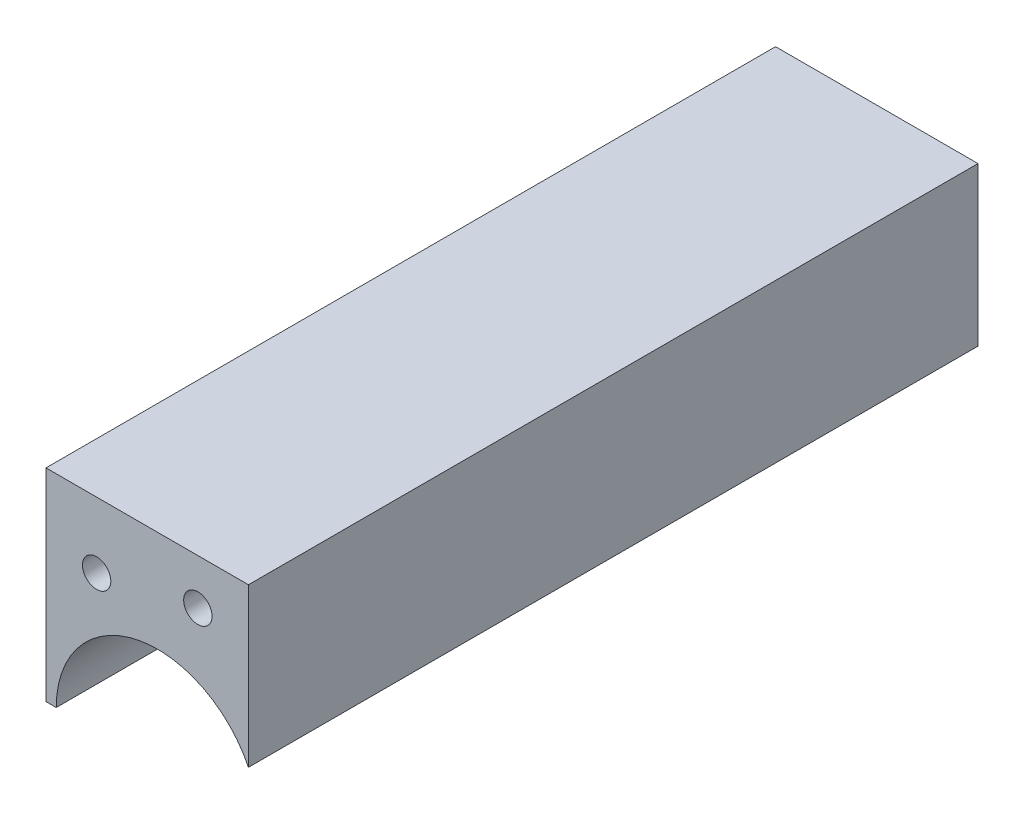
ISO-10303-21;
HEADER;
FILE_DESCRIPTION(('STEP AP214'),'2;1');
FILE_NAME('part.step','',(''),(''),'','','');
FILE_SCHEMA(('AUTOMOTIVE_DESIGN { 1 0 10303 214 1 1 1 1 }'));
ENDSEC;
DATA;
#1=APPLICATION_CONTEXT('core data for automotive mechanical design processes');
#2=APPLICATION_PROTOCOL_DEFINITION('international standard','automotive_design',2000,#1);
#3=PRODUCT_CONTEXT('',#1,'mechanical');
#4=PRODUCT('Part','Part','',(#3));
#5=PRODUCT_RELATED_PRODUCT_CATEGORY('part','',(#4));
#6=PRODUCT_DEFINITION_FORMATION('','',#4);
#7=PRODUCT_DEFINITION_CONTEXT('part definition',#1,'design');
#8=PRODUCT_DEFINITION('design','',#6,#7);
#9=PRODUCT_DEFINITION_SHAPE('','',#8);
#10=(LENGTH_UNIT() NAMED_UNIT(*) SI_UNIT(.MILLI.,.METRE.));
#11=(NAMED_UNIT(*) PLANE_ANGLE_UNIT() SI_UNIT($,.RADIAN.));
#12=(NAMED_UNIT(*) SI_UNIT($,.STERADIAN.) SOLID_ANGLE_UNIT());
#13=UNCERTAINTY_MEASURE_WITH_UNIT(LENGTH_MEASURE(1.E-05),#10,'distance_accuracy_value','');
#14=(GEOMETRIC_REPRESENTATION_CONTEXT(3) GLOBAL_UNCERTAINTY_ASSIGNED_CONTEXT((#13)) GLOBAL_UNIT_ASSIGNED_CONTEXT((#10,
#11,#12)) REPRESENTATION_CONTEXT('',''));
#15=CARTESIAN_POINT('',(0.,0.,0.));
#16=DIRECTION('',(0.,0.,1.));
#17=DIRECTION('',(1.,0.,0.));
#18=AXIS2_PLACEMENT_3D('',#15,#16,#17);
#19=CARTESIAN_POINT('',(11.01,0.,72.07));
#20=DIRECTION('',(0.,0.,1.));
#21=DIRECTION('',(1.,0.,0.));
#22=AXIS2_PLACEMENT_3D('',#19,#20,#21);
#23=PLANE('',#22);
#24=CARTESIAN_POINT('',(5.,13.5,72.07));
#25=DIRECTION('',(0.,0.,1.));
#26=DIRECTION('',(1.,0.,0.));
#27=AXIS2_PLACEMENT_3D('',#24,#25,#26);
#28=CIRCLE('',#27,1.4);
#29=CARTESIAN_POINT('',(3.6,13.5,72.07));
#30=VERTEX_POINT('',#29);
#31=EDGE_CURVE('E118',#30,#30,#28,.T.);
#32=ORIENTED_EDGE('',*,*,#31,.F.);
#33=EDGE_LOOP('',(#32));
#34=FACE_BOUND('',#33,.T.);
#35=DIRECTION('',(0.,-1.,0.));
#36=VECTOR('',#35,1.);
#37=CARTESIAN_POINT('',(0.,0.,72.07));
#38=LINE('',#37,#36);
#39=CARTESIAN_POINT('',(0.,20.,72.07));
#40=VERTEX_POINT('',#39);
#41=CARTESIAN_POINT('',(0.,0.,72.07));
#42=VERTEX_POINT('',#41);
#43=EDGE_CURVE('E123',#40,#42,#38,.T.);
#44=ORIENTED_EDGE('',*,*,#43,.T.);
#45=DIRECTION('',(1.,0.,0.));
#46=VECTOR('',#45,1.);
#47=CARTESIAN_POINT('',(0.,0.,72.07));
#48=LINE('',#47,#46);
#49=CARTESIAN_POINT('',(1.00999999999999,0.,72.07));
#50=VERTEX_POINT('',#49);
#51=EDGE_CURVE('E90',#42,#50,#48,.T.);
#52=ORIENTED_EDGE('',*,*,#51,.T.);
#53=CARTESIAN_POINT('',(11.01,0.,72.07));
#54=DIRECTION('',(0.,0.,-1.));
#55=DIRECTION('',(1.,0.,0.));
#56=AXIS2_PLACEMENT_3D('',#53,#54,#55);
#57=CIRCLE('',#56,10.);
#58=CARTESIAN_POINT('',(20.,4.37948627124234,72.07));
#59=VERTEX_POINT('',#58);
#60=EDGE_CURVE('E94',#50,#59,#57,.T.);
#61=ORIENTED_EDGE('',*,*,#60,.T.);
#62=DIRECTION('',(0.,1.,0.));
#63=VECTOR('',#62,1.);
#64=CARTESIAN_POINT('',(20.,4.37948627124234,72.07));
#65=LINE('',#64,#63);
#66=CARTESIAN_POINT('',(20.,20.,72.07));
#67=VERTEX_POINT('',#66);
#68=EDGE_CURVE('E98',#59,#67,#65,.T.);
#69=ORIENTED_EDGE('',*,*,#68,.T.);
#70=DIRECTION('',(-1.,0.,0.));
#71=VECTOR('',#70,1.);
#72=CARTESIAN_POINT('',(0.,20.,72.07));
#73=LINE('',#72,#71);
#74=EDGE_CURVE('E56',#67,#40,#73,.T.);
#75=ORIENTED_EDGE('',*,*,#74,.T.);
#76=EDGE_LOOP('',(#44,#52,#61,#69,#75));
#77=FACE_BOUND('',#76,.T.);
#78=CARTESIAN_POINT('',(15.,15.5,72.07));
#79=DIRECTION('',(0.,0.,1.));
#80=DIRECTION('',(1.,0.,0.));
#81=AXIS2_PLACEMENT_3D('',#78,#79,#80);
#82=CIRCLE('',#81,1.4);
#83=CARTESIAN_POINT('',(13.6,15.5,72.07));
#84=VERTEX_POINT('',#83);
#85=EDGE_CURVE('E160',#84,#84,#82,.T.);
#86=ORIENTED_EDGE('',*,*,#85,.F.);
#87=EDGE_LOOP('',(#86));
#88=FACE_BOUND('',#87,.T.);
#89=ADVANCED_FACE('F39',(#34,#77,#88),#23,.T.);
#90=CARTESIAN_POINT('',(11.01,0.,0.));
#91=DIRECTION('',(0.,0.,1.));
#92=DIRECTION('',(1.,0.,0.));
#93=AXIS2_PLACEMENT_3D('',#90,#91,#92);
#94=PLANE('',#93);
#95=DIRECTION('',(0.,-1.,0.));
#96=VECTOR('',#95,1.);
#97=CARTESIAN_POINT('',(0.,0.,0.));
#98=LINE('',#97,#96);
#99=CARTESIAN_POINT('',(0.,20.,0.));
#100=VERTEX_POINT('',#99);
#101=CARTESIAN_POINT('',(0.,0.,0.));
#102=VERTEX_POINT('',#101);
#103=EDGE_CURVE('E114',#100,#102,#98,.T.);
#104=ORIENTED_EDGE('',*,*,#103,.F.);
#105=DIRECTION('',(-1.,0.,0.));
#106=VECTOR('',#105,1.);
#107=CARTESIAN_POINT('',(0.,20.,0.));
#108=LINE('',#107,#106);
#109=CARTESIAN_POINT('',(20.,20.,0.));
#110=VERTEX_POINT('',#109);
#111=EDGE_CURVE('E82',#110,#100,#108,.T.);
#112=ORIENTED_EDGE('',*,*,#111,.F.);
#113=DIRECTION('',(0.,1.,0.));
#114=VECTOR('',#113,1.);
#115=CARTESIAN_POINT('',(20.,4.37948627124234,0.));
#116=LINE('',#115,#114);
#117=CARTESIAN_POINT('',(20.,4.37948627124234,0.));
#118=VERTEX_POINT('',#117);
#119=EDGE_CURVE('E76',#118,#110,#116,.T.);
#120=ORIENTED_EDGE('',*,*,#119,.F.);
#121=CARTESIAN_POINT('',(11.01,0.,0.));
#122=DIRECTION('',(0.,0.,-1.));
#123=DIRECTION('',(1.,0.,0.));
#124=AXIS2_PLACEMENT_3D('',#121,#122,#123);
#125=CIRCLE('',#124,10.);
#126=CARTESIAN_POINT('',(1.00999999999999,0.,0.));
#127=VERTEX_POINT('',#126);
#128=EDGE_CURVE('E105',#127,#118,#125,.T.);
#129=ORIENTED_EDGE('',*,*,#128,.F.);
#130=DIRECTION('',(1.,0.,0.));
#131=VECTOR('',#130,1.);
#132=CARTESIAN_POINT('',(0.,0.,0.));
#133=LINE('',#132,#131);
#134=EDGE_CURVE('E117',#102,#127,#133,.T.);
#135=ORIENTED_EDGE('',*,*,#134,.F.);
#136=EDGE_LOOP('',(#104,#112,#120,#129,#135));
#137=FACE_BOUND('',#136,.T.);
#138=CARTESIAN_POINT('',(5.,13.5,0.));
#139=DIRECTION('',(0.,0.,1.));
#140=DIRECTION('',(1.,0.,0.));
#141=AXIS2_PLACEMENT_3D('',#138,#139,#140);
#142=CIRCLE('',#141,1.4);
#143=CARTESIAN_POINT('',(3.6,13.5,0.));
#144=VERTEX_POINT('',#143);
#145=EDGE_CURVE('E166',#144,#144,#142,.T.);
#146=ORIENTED_EDGE('',*,*,#145,.T.);
#147=EDGE_LOOP('',(#146));
#148=FACE_BOUND('',#147,.T.);
#149=CARTESIAN_POINT('',(15.,15.5,0.));
#150=DIRECTION('',(0.,0.,1.));
#151=DIRECTION('',(1.,0.,0.));
#152=AXIS2_PLACEMENT_3D('',#149,#150,#151);
#153=CIRCLE('',#152,1.4);
#154=CARTESIAN_POINT('',(13.6,15.5,0.));
#155=VERTEX_POINT('',#154);
#156=EDGE_CURVE('E163',#155,#155,#153,.T.);
#157=ORIENTED_EDGE('',*,*,#156,.T.);
#158=EDGE_LOOP('',(#157));
#159=FACE_BOUND('',#158,.T.);
#160=ADVANCED_FACE('F127',(#137,#148,#159),#94,.F.);
#161=CARTESIAN_POINT('',(0.,0.,72.07));
#162=DIRECTION('',(1.,0.,0.));
#163=DIRECTION('',(0.,0.,-1.));
#164=AXIS2_PLACEMENT_3D('',#161,#162,#163);
#165=PLANE('',#164);
#166=ORIENTED_EDGE('',*,*,#103,.T.);
#167=DIRECTION('',(0.,0.,-1.));
#168=VECTOR('',#167,1.);
#169=CARTESIAN_POINT('',(0.,0.,72.07));
#170=LINE('',#169,#168);
#171=EDGE_CURVE('E11',#42,#102,#170,.T.);
#172=ORIENTED_EDGE('',*,*,#171,.F.);
#173=ORIENTED_EDGE('',*,*,#43,.F.);
#174=DIRECTION('',(0.,0.,-1.));
#175=VECTOR('',#174,1.);
#176=CARTESIAN_POINT('',(0.,20.,72.07));
#177=LINE('',#176,#175);
#178=EDGE_CURVE('E110',#40,#100,#177,.T.);
#179=ORIENTED_EDGE('',*,*,#178,.T.);
#180=EDGE_LOOP('',(#166,#172,#173,#179));
#181=FACE_BOUND('',#180,.T.);
#182=ADVANCED_FACE('F41',(#181),#165,.F.);
#183=CARTESIAN_POINT('',(0.,0.,72.07));
#184=DIRECTION('',(0.,1.,0.));
#185=DIRECTION('',(0.,0.,1.));
#186=AXIS2_PLACEMENT_3D('',#183,#184,#185);
#187=PLANE('',#186);
#188=ORIENTED_EDGE('',*,*,#134,.T.);
#189=DIRECTION('',(0.,0.,-1.));
#190=VECTOR('',#189,1.);
#191=CARTESIAN_POINT('',(1.00999999999999,0.,72.07));
#192=LINE('',#191,#190);
#193=EDGE_CURVE('E48',#50,#127,#192,.T.);
#194=ORIENTED_EDGE('',*,*,#193,.F.);
#195=ORIENTED_EDGE('',*,*,#51,.F.);
#196=ORIENTED_EDGE('',*,*,#171,.T.);
#197=EDGE_LOOP('',(#188,#194,#195,#196));
#198=FACE_BOUND('',#197,.T.);
#199=ADVANCED_FACE('F201',(#198),#187,.F.);
#200=CARTESIAN_POINT('',(11.01,0.,72.07));
#201=DIRECTION('',(0.,0.,-1.));
#202=DIRECTION('',(-1.,0.,0.));
#203=AXIS2_PLACEMENT_3D('',#200,#201,#202);
#204=CYLINDRICAL_SURFACE('',#203,10.);
#205=ORIENTED_EDGE('',*,*,#128,.T.);
#206=DIRECTION('',(0.,0.,-1.));
#207=VECTOR('',#206,1.);
#208=CARTESIAN_POINT('',(20.,4.37948627124234,72.07));
#209=LINE('',#208,#207);
#210=EDGE_CURVE('E102',#59,#118,#209,.T.);
#211=ORIENTED_EDGE('',*,*,#210,.F.);
#212=ORIENTED_EDGE('',*,*,#60,.F.);
#213=ORIENTED_EDGE('',*,*,#193,.T.);
#214=EDGE_LOOP('',(#205,#211,#212,#213));
#215=FACE_BOUND('',#214,.T.);
#216=ADVANCED_FACE('F103',(#215),#204,.F.);
#217=CARTESIAN_POINT('',(20.,4.37948627124234,72.07));
#218=DIRECTION('',(-1.,0.,0.));
#219=DIRECTION('',(0.,0.,1.));
#220=AXIS2_PLACEMENT_3D('',#217,#218,#219);
#221=PLANE('',#220);
#222=ORIENTED_EDGE('',*,*,#119,.T.);
#223=DIRECTION('',(0.,0.,-1.));
#224=VECTOR('',#223,1.);
#225=CARTESIAN_POINT('',(20.,20.,72.07));
#226=LINE('',#225,#224);
#227=EDGE_CURVE('E106',#67,#110,#226,.T.);
#228=ORIENTED_EDGE('',*,*,#227,.F.);
#229=ORIENTED_EDGE('',*,*,#68,.F.);
#230=ORIENTED_EDGE('',*,*,#210,.T.);
#231=EDGE_LOOP('',(#222,#228,#229,#230));
#232=FACE_BOUND('',#231,.T.);
#233=ADVANCED_FACE('F108',(#232),#221,.F.);
#234=CARTESIAN_POINT('',(0.,20.,72.07));
#235=DIRECTION('',(0.,-1.,0.));
#236=DIRECTION('',(0.,0.,-1.));
#237=AXIS2_PLACEMENT_3D('',#234,#235,#236);
#238=PLANE('',#237);
#239=ORIENTED_EDGE('',*,*,#111,.T.);
#240=ORIENTED_EDGE('',*,*,#178,.F.);
#241=ORIENTED_EDGE('',*,*,#74,.F.);
#242=ORIENTED_EDGE('',*,*,#227,.T.);
#243=EDGE_LOOP('',(#239,#240,#241,#242));
#244=FACE_BOUND('',#243,.T.);
#245=ADVANCED_FACE('F132',(#244),#238,.F.);
#246=CARTESIAN_POINT('',(5.,13.5,72.07));
#247=DIRECTION('',(0.,0.,-1.));
#248=DIRECTION('',(-1.,0.,0.));
#249=AXIS2_PLACEMENT_3D('',#246,#247,#248);
#250=CYLINDRICAL_SURFACE('',#249,1.4);
#251=CARTESIAN_POINT('',(3.6,13.5,72.07));
#252=CARTESIAN_POINT('',(3.6,13.5,71.3192708333333));
#253=CARTESIAN_POINT('',(3.6,13.5,70.5685416666667));
#254=CARTESIAN_POINT('',(3.6,13.5,69.0670833333333));
#255=CARTESIAN_POINT('',(3.6,13.5,68.3163541666667));
#256=CARTESIAN_POINT('',(3.6,13.5,66.8148958333333));
#257=CARTESIAN_POINT('',(3.6,13.5,66.0641666666667));
#258=CARTESIAN_POINT('',(3.6,13.5,64.5627083333333));
#259=CARTESIAN_POINT('',(3.6,13.5,63.8119791666667));
#260=CARTESIAN_POINT('',(3.6,13.5,62.3105208333333));
#261=CARTESIAN_POINT('',(3.6,13.5,61.5597916666666));
#262=CARTESIAN_POINT('',(3.6,13.5,60.0583333333333));
#263=CARTESIAN_POINT('',(3.6,13.5,59.3076041666666));
#264=CARTESIAN_POINT('',(3.6,13.5,57.8061458333333));
#265=CARTESIAN_POINT('',(3.6,13.5,57.0554166666667));
#266=CARTESIAN_POINT('',(3.6,13.5,55.5539583333333));
#267=CARTESIAN_POINT('',(3.6,13.5,54.8032291666667));
#268=CARTESIAN_POINT('',(3.6,13.5,53.3017708333333));
#269=CARTESIAN_POINT('',(3.6,13.5,52.5510416666666));
#270=CARTESIAN_POINT('',(3.6,13.5,51.0495833333333));
#271=CARTESIAN_POINT('',(3.6,13.5,50.2988541666667));
#272=CARTESIAN_POINT('',(3.6,13.5,48.7973958333333));
#273=CARTESIAN_POINT('',(3.6,13.5,48.0466666666666));
#274=CARTESIAN_POINT('',(3.6,13.5,46.5452083333333));
#275=CARTESIAN_POINT('',(3.6,13.5,45.7944791666666));
#276=CARTESIAN_POINT('',(3.6,13.5,44.2930208333333));
#277=CARTESIAN_POINT('',(3.6,13.5,43.5422916666666));
#278=CARTESIAN_POINT('',(3.6,13.5,42.0408333333333));
#279=CARTESIAN_POINT('',(3.6,13.5,41.2901041666667));
#280=CARTESIAN_POINT('',(3.6,13.5,39.7886458333333));
#281=CARTESIAN_POINT('',(3.6,13.5,39.0379166666667));
#282=CARTESIAN_POINT('',(3.6,13.5,37.5364583333333));
#283=CARTESIAN_POINT('',(3.6,13.5,36.7857291666666));
#284=CARTESIAN_POINT('',(3.6,13.5,35.2842708333333));
#285=CARTESIAN_POINT('',(3.6,13.5,34.5335416666666));
#286=CARTESIAN_POINT('',(3.6,13.5,33.0320833333333));
#287=CARTESIAN_POINT('',(3.6,13.5,32.2813541666666));
#288=CARTESIAN_POINT('',(3.6,13.5,30.7798958333333));
#289=CARTESIAN_POINT('',(3.6,13.5,30.0291666666666));
#290=CARTESIAN_POINT('',(3.6,13.5,28.5277083333333));
#291=CARTESIAN_POINT('',(3.6,13.5,27.7769791666666));
#292=CARTESIAN_POINT('',(3.6,13.5,26.2755208333333));
#293=CARTESIAN_POINT('',(3.6,13.5,25.5247916666666));
#294=CARTESIAN_POINT('',(3.6,13.5,24.0233333333333));
#295=CARTESIAN_POINT('',(3.6,13.5,23.2726041666666));
#296=CARTESIAN_POINT('',(3.6,13.5,21.7711458333333));
#297=CARTESIAN_POINT('',(3.6,13.5,21.0204166666666));
#298=CARTESIAN_POINT('',(3.6,13.5,19.5189583333333));
#299=CARTESIAN_POINT('',(3.6,13.5,18.7682291666666));
#300=CARTESIAN_POINT('',(3.6,13.5,17.2667708333333));
#301=CARTESIAN_POINT('',(3.6,13.5,16.5160416666666));
#302=CARTESIAN_POINT('',(3.6,13.5,15.0145833333333));
#303=CARTESIAN_POINT('',(3.6,13.5,14.2638541666666));
#304=CARTESIAN_POINT('',(3.6,13.5,12.7623958333333));
#305=CARTESIAN_POINT('',(3.6,13.5,12.0116666666666));
#306=CARTESIAN_POINT('',(3.6,13.5,10.5102083333333));
#307=CARTESIAN_POINT('',(3.6,13.5,9.75947916666666));
#308=CARTESIAN_POINT('',(3.6,13.5,8.25802083333333));
#309=CARTESIAN_POINT('',(3.6,13.5,7.50729166666666));
#310=CARTESIAN_POINT('',(3.6,13.5,6.00583333333333));
#311=CARTESIAN_POINT('',(3.6,13.5,5.25510416666666));
#312=CARTESIAN_POINT('',(3.6,13.5,3.75364583333332));
#313=CARTESIAN_POINT('',(3.6,13.5,3.00291666666666));
#314=CARTESIAN_POINT('',(3.6,13.5,1.50145833333332));
#315=CARTESIAN_POINT('',(3.6,13.5,0.750729166666654));
#316=CARTESIAN_POINT('',(3.6,13.5,0.));
#317=B_SPLINE_CURVE_WITH_KNOTS('',3,(#251,#252,#253,#254,#255,#256,#257,#258,#259,#260,#261,
#262,#263,#264,#265,#266,#267,#268,#269,#270,#271,#272,#273,#274,#275,#276,#277,#278,#279,#280,
#281,#282,#283,#284,#285,#286,#287,#288,#289,#290,#291,#292,#293,#294,#295,#296,#297,#298,#299,
#300,#301,#302,#303,#304,#305,#306,#307,#308,#309,#310,#311,#312,#313,#314,#315,#316),
.UNSPECIFIED.,.F.,.F.,(4,2,2,2,2,2,2,2,2,2,2,2,2,2,2,2,2,2,2,2,2,2,2,2,2,2,2,2,2,2,2,2,4),(0.,
2.2521875,4.504375,6.75656250000001,9.00875000000001,11.2609375,13.513125,15.7653125,18.0175,
20.2696875,22.521875,24.7740625,27.02625,29.2784375,31.530625,33.7828125,36.035,38.2871875,
40.539375,42.7915625,45.04375,47.2959375,49.548125,51.8003125,54.0525,56.3046875,58.556875,
60.8090625,63.06125,65.3134375,67.565625,69.8178125,72.07),.UNSPECIFIED.);
#318=EDGE_CURVE('BSEAM134',#30,#144,#317,.T.);
#319=ORIENTED_EDGE('',*,*,#31,.T.);
#320=ORIENTED_EDGE('',*,*,#145,.F.);
#321=ORIENTED_EDGE('',*,*,#318,.T.);
#322=ORIENTED_EDGE('',*,*,#318,.F.);
#323=EDGE_LOOP('',(#319,#321,#320,#322));
#324=FACE_BOUND('',#323,.T.);
#325=ADVANCED_FACE('F134',(#324),#250,.F.);
#326=CARTESIAN_POINT('',(15.,15.5,72.07));
#327=DIRECTION('',(0.,0.,-1.));
#328=DIRECTION('',(-1.,0.,0.));
#329=AXIS2_PLACEMENT_3D('',#326,#327,#328);
#330=CYLINDRICAL_SURFACE('',#329,1.4);
#331=CARTESIAN_POINT('',(13.6,15.5,72.07));
#332=CARTESIAN_POINT('',(13.6,15.5,71.3192708333333));
#333=CARTESIAN_POINT('',(13.6,15.5,70.5685416666667));
#334=CARTESIAN_POINT('',(13.6,15.5,69.0670833333333));
#335=CARTESIAN_POINT('',(13.6,15.5,68.3163541666667));
#336=CARTESIAN_POINT('',(13.6,15.5,66.8148958333333));
#337=CARTESIAN_POINT('',(13.6,15.5,66.0641666666667));
#338=CARTESIAN_POINT('',(13.6,15.5,64.5627083333333));
#339=CARTESIAN_POINT('',(13.6,15.5,63.8119791666667));
#340=CARTESIAN_POINT('',(13.6,15.5,62.3105208333333));
#341=CARTESIAN_POINT('',(13.6,15.5,61.5597916666666));
#342=CARTESIAN_POINT('',(13.6,15.5,60.0583333333333));
#343=CARTESIAN_POINT('',(13.6,15.5,59.3076041666666));
#344=CARTESIAN_POINT('',(13.6,15.5,57.8061458333333));
#345=CARTESIAN_POINT('',(13.6,15.5,57.0554166666667));
#346=CARTESIAN_POINT('',(13.6,15.5,55.5539583333333));
#347=CARTESIAN_POINT('',(13.6,15.5,54.8032291666667));
#348=CARTESIAN_POINT('',(13.6,15.5,53.3017708333333));
#349=CARTESIAN_POINT('',(13.6,15.5,52.5510416666666));
#350=CARTESIAN_POINT('',(13.6,15.5,51.0495833333333));
#351=CARTESIAN_POINT('',(13.6,15.5,50.2988541666667));
#352=CARTESIAN_POINT('',(13.6,15.5,48.7973958333333));
#353=CARTESIAN_POINT('',(13.6,15.5,48.0466666666666));
#354=CARTESIAN_POINT('',(13.6,15.5,46.5452083333333));
#355=CARTESIAN_POINT('',(13.6,15.5,45.7944791666666));
#356=CARTESIAN_POINT('',(13.6,15.5,44.2930208333333));
#357=CARTESIAN_POINT('',(13.6,15.5,43.5422916666666));
#358=CARTESIAN_POINT('',(13.6,15.5,42.0408333333333));
#359=CARTESIAN_POINT('',(13.6,15.5,41.2901041666667));
#360=CARTESIAN_POINT('',(13.6,15.5,39.7886458333333));
#361=CARTESIAN_POINT('',(13.6,15.5,39.0379166666667));
#362=CARTESIAN_POINT('',(13.6,15.5,37.5364583333333));
#363=CARTESIAN_POINT('',(13.6,15.5,36.7857291666666));
#364=CARTESIAN_POINT('',(13.6,15.5,35.2842708333333));
#365=CARTESIAN_POINT('',(13.6,15.5,34.5335416666666));
#366=CARTESIAN_POINT('',(13.6,15.5,33.0320833333333));
#367=CARTESIAN_POINT('',(13.6,15.5,32.2813541666666));
#368=CARTESIAN_POINT('',(13.6,15.5,30.7798958333333));
#369=CARTESIAN_POINT('',(13.6,15.5,30.0291666666666));
#370=CARTESIAN_POINT('',(13.6,15.5,28.5277083333333));
#371=CARTESIAN_POINT('',(13.6,15.5,27.7769791666666));
#372=CARTESIAN_POINT('',(13.6,15.5,26.2755208333333));
#373=CARTESIAN_POINT('',(13.6,15.5,25.5247916666666));
#374=CARTESIAN_POINT('',(13.6,15.5,24.0233333333333));
#375=CARTESIAN_POINT('',(13.6,15.5,23.2726041666666));
#376=CARTESIAN_POINT('',(13.6,15.5,21.7711458333333));
#377=CARTESIAN_POINT('',(13.6,15.5,21.0204166666666));
#378=CARTESIAN_POINT('',(13.6,15.5,19.5189583333333));
#379=CARTESIAN_POINT('',(13.6,15.5,18.7682291666666));
#380=CARTESIAN_POINT('',(13.6,15.5,17.2667708333333));
#381=CARTESIAN_POINT('',(13.6,15.5,16.5160416666666));
#382=CARTESIAN_POINT('',(13.6,15.5,15.0145833333333));
#383=CARTESIAN_POINT('',(13.6,15.5,14.2638541666666));
#384=CARTESIAN_POINT('',(13.6,15.5,12.7623958333333));
#385=CARTESIAN_POINT('',(13.6,15.5,12.0116666666666));
#386=CARTESIAN_POINT('',(13.6,15.5,10.5102083333333));
#387=CARTESIAN_POINT('',(13.6,15.5,9.75947916666666));
#388=CARTESIAN_POINT('',(13.6,15.5,8.25802083333333));
#389=CARTESIAN_POINT('',(13.6,15.5,7.50729166666666));
#390=CARTESIAN_POINT('',(13.6,15.5,6.00583333333333));
#391=CARTESIAN_POINT('',(13.6,15.5,5.25510416666666));
#392=CARTESIAN_POINT('',(13.6,15.5,3.75364583333332));
#393=CARTESIAN_POINT('',(13.6,15.5,3.00291666666666));
#394=CARTESIAN_POINT('',(13.6,15.5,1.50145833333332));
#395=CARTESIAN_POINT('',(13.6,15.5,0.750729166666654));
#396=CARTESIAN_POINT('',(13.6,15.5,0.));
#397=B_SPLINE_CURVE_WITH_KNOTS('',3,(#331,#332,#333,#334,#335,#336,#337,#338,#339,#340,#341,
#342,#343,#344,#345,#346,#347,#348,#349,#350,#351,#352,#353,#354,#355,#356,#357,#358,#359,#360,
#361,#362,#363,#364,#365,#366,#367,#368,#369,#370,#371,#372,#373,#374,#375,#376,#377,#378,#379,
#380,#381,#382,#383,#384,#385,#386,#387,#388,#389,#390,#391,#392,#393,#394,#395,#396),
.UNSPECIFIED.,.F.,.F.,(4,2,2,2,2,2,2,2,2,2,2,2,2,2,2,2,2,2,2,2,2,2,2,2,2,2,2,2,2,2,2,2,4),(0.,
2.2521875,4.504375,6.75656250000001,9.00875000000001,11.2609375,13.513125,15.7653125,18.0175,
20.2696875,22.521875,24.7740625,27.02625,29.2784375,31.530625,33.7828125,36.035,38.2871875,
40.539375,42.7915625,45.04375,47.2959375,49.548125,51.8003125,54.0525,56.3046875,58.556875,
60.8090625,63.06125,65.3134375,67.565625,69.8178125,72.07),.UNSPECIFIED.);
#398=EDGE_CURVE('BSEAM140',#84,#155,#397,.T.);
#399=ORIENTED_EDGE('',*,*,#85,.T.);
#400=ORIENTED_EDGE('',*,*,#156,.F.);
#401=ORIENTED_EDGE('',*,*,#398,.T.);
#402=ORIENTED_EDGE('',*,*,#398,.F.);
#403=EDGE_LOOP('',(#399,#401,#400,#402));
#404=FACE_BOUND('',#403,.T.);
#405=ADVANCED_FACE('F140',(#404),#330,.F.);
#406=CLOSED_SHELL('',(#89,#160,#182,#199,#216,#233,#245,#325,#405));
#407=MANIFOLD_SOLID_BREP('B2',#406);
#408=ADVANCED_BREP_SHAPE_REPRESENTATION('',(#18,#407),#14);
#409=SHAPE_DEFINITION_REPRESENTATION(#9,#408);
ENDSEC;
END-ISO-10303-21;
